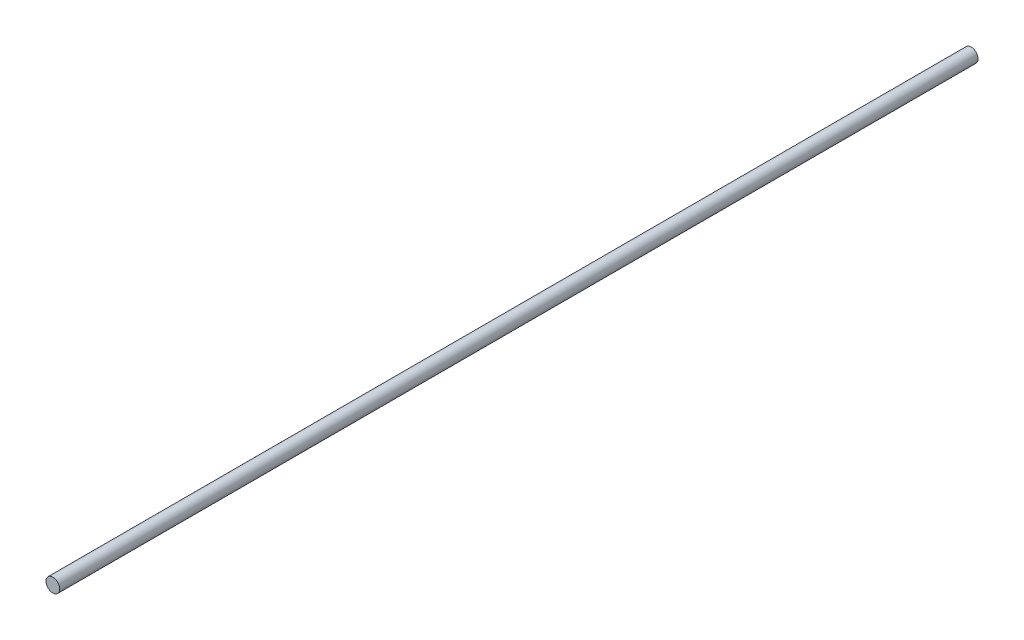
ISO-10303-21;
HEADER;
FILE_DESCRIPTION(('STEP AP214'),'2;1');
FILE_NAME('part.step','',(''),(''),'','','');
FILE_SCHEMA(('AUTOMOTIVE_DESIGN { 1 0 10303 214 1 1 1 1 }'));
ENDSEC;
DATA;
#1=APPLICATION_CONTEXT('core data for automotive mechanical design processes');
#2=APPLICATION_PROTOCOL_DEFINITION('international standard','automotive_design',2000,#1);
#3=PRODUCT_CONTEXT('',#1,'mechanical');
#4=PRODUCT('Part','Part','',(#3));
#5=PRODUCT_RELATED_PRODUCT_CATEGORY('part','',(#4));
#6=PRODUCT_DEFINITION_FORMATION('','',#4);
#7=PRODUCT_DEFINITION_CONTEXT('part definition',#1,'design');
#8=PRODUCT_DEFINITION('design','',#6,#7);
#9=PRODUCT_DEFINITION_SHAPE('','',#8);
#10=(LENGTH_UNIT() NAMED_UNIT(*) SI_UNIT(.MILLI.,.METRE.));
#11=(NAMED_UNIT(*) PLANE_ANGLE_UNIT() SI_UNIT($,.RADIAN.));
#12=(NAMED_UNIT(*) SI_UNIT($,.STERADIAN.) SOLID_ANGLE_UNIT());
#13=UNCERTAINTY_MEASURE_WITH_UNIT(LENGTH_MEASURE(1.E-05),#10,'distance_accuracy_value','');
#14=(GEOMETRIC_REPRESENTATION_CONTEXT(3) GLOBAL_UNCERTAINTY_ASSIGNED_CONTEXT((#13)) GLOBAL_UNIT_ASSIGNED_CONTEXT((#10,
#11,#12)) REPRESENTATION_CONTEXT('',''));
#15=CARTESIAN_POINT('',(0.,0.,0.));
#16=DIRECTION('',(0.,0.,1.));
#17=DIRECTION('',(1.,0.,0.));
#18=AXIS2_PLACEMENT_3D('',#15,#16,#17);
#19=CARTESIAN_POINT('',(0.,0.,267.75));
#20=DIRECTION('',(0.,0.,-1.));
#21=DIRECTION('',(-1.,0.,0.));
#22=AXIS2_PLACEMENT_3D('',#19,#20,#21);
#23=CYLINDRICAL_SURFACE('',#22,4.);
#24=CARTESIAN_POINT('',(0.,0.,267.75));
#25=DIRECTION('',(0.,0.,1.));
#26=DIRECTION('',(1.,0.,0.));
#27=AXIS2_PLACEMENT_3D('',#24,#25,#26);
#28=CIRCLE('',#27,4.);
#29=CARTESIAN_POINT('',(4.,0.,267.75));
#30=VERTEX_POINT('',#29);
#31=EDGE_CURVE('E10',#30,#30,#28,.T.);
#32=ORIENTED_EDGE('',*,*,#31,.F.);
#33=EDGE_LOOP('',(#32));
#34=FACE_BOUND('',#33,.T.);
#35=CARTESIAN_POINT('',(0.,0.,-267.75));
#36=DIRECTION('',(0.,0.,1.));
#37=DIRECTION('',(1.,0.,0.));
#38=AXIS2_PLACEMENT_3D('',#35,#36,#37);
#39=CIRCLE('',#38,4.);
#40=CARTESIAN_POINT('',(4.,0.,-267.75));
#41=VERTEX_POINT('',#40);
#42=EDGE_CURVE('E34',#41,#41,#39,.T.);
#43=ORIENTED_EDGE('',*,*,#42,.T.);
#44=EDGE_LOOP('',(#43));
#45=FACE_BOUND('',#44,.T.);
#46=ADVANCED_FACE('F31',(#34,#45),#23,.T.);
#47=CARTESIAN_POINT('',(0.,0.,267.75));
#48=DIRECTION('',(0.,0.,1.));
#49=DIRECTION('',(1.,0.,0.));
#50=AXIS2_PLACEMENT_3D('',#47,#48,#49);
#51=PLANE('',#50);
#52=ORIENTED_EDGE('',*,*,#31,.T.);
#53=EDGE_LOOP('',(#52));
#54=FACE_BOUND('',#53,.T.);
#55=ADVANCED_FACE('F46',(#54),#51,.T.);
#56=CARTESIAN_POINT('',(0.,0.,-267.75));
#57=DIRECTION('',(0.,0.,1.));
#58=DIRECTION('',(1.,0.,0.));
#59=AXIS2_PLACEMENT_3D('',#56,#57,#58);
#60=PLANE('',#59);
#61=ORIENTED_EDGE('',*,*,#42,.F.);
#62=EDGE_LOOP('',(#61));
#63=FACE_BOUND('',#62,.T.);
#64=ADVANCED_FACE('F44',(#63),#60,.F.);
#65=CLOSED_SHELL('',(#46,#55,#64));
#66=MANIFOLD_SOLID_BREP('B2',#65);
#67=ADVANCED_BREP_SHAPE_REPRESENTATION('',(#18,#66),#14);
#68=SHAPE_DEFINITION_REPRESENTATION(#9,#67);
ENDSEC;
END-ISO-10303-21;
